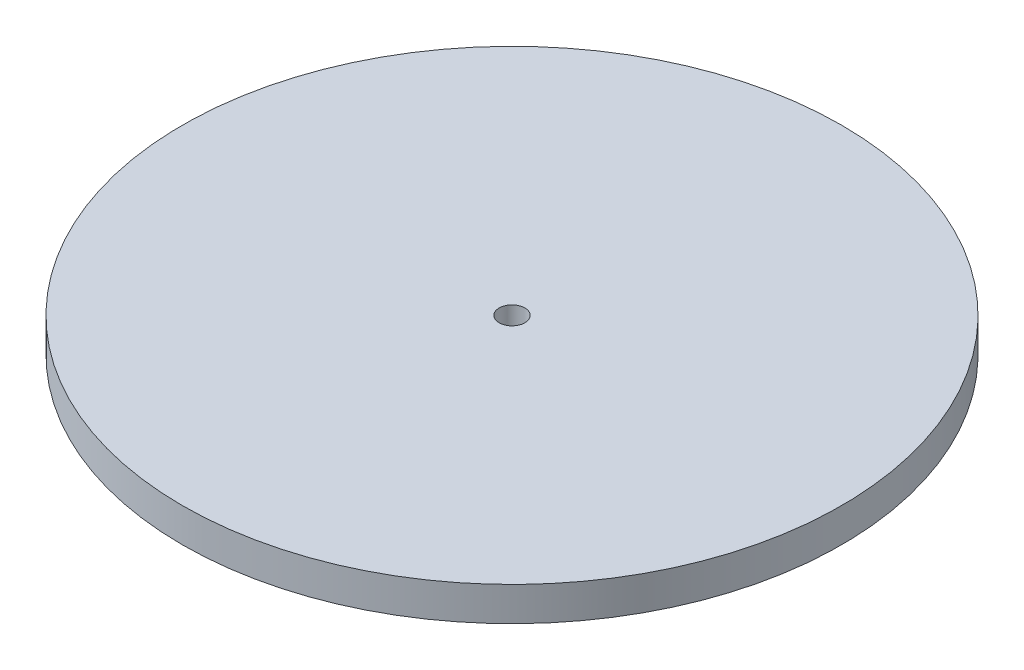
ISO-10303-21;
HEADER;
FILE_DESCRIPTION(('STEP AP214'),'2;1');
FILE_NAME('part.step','',(''),(''),'','','');
FILE_SCHEMA(('AUTOMOTIVE_DESIGN { 1 0 10303 214 1 1 1 1 }'));
ENDSEC;
DATA;
#1=APPLICATION_CONTEXT('core data for automotive mechanical design processes');
#2=APPLICATION_PROTOCOL_DEFINITION('international standard','automotive_design',2000,#1);
#3=PRODUCT_CONTEXT('',#1,'mechanical');
#4=PRODUCT('Part','Part','',(#3));
#5=PRODUCT_RELATED_PRODUCT_CATEGORY('part','',(#4));
#6=PRODUCT_DEFINITION_FORMATION('','',#4);
#7=PRODUCT_DEFINITION_CONTEXT('part definition',#1,'design');
#8=PRODUCT_DEFINITION('design','',#6,#7);
#9=PRODUCT_DEFINITION_SHAPE('','',#8);
#10=(LENGTH_UNIT() NAMED_UNIT(*) SI_UNIT(.MILLI.,.METRE.));
#11=(NAMED_UNIT(*) PLANE_ANGLE_UNIT() SI_UNIT($,.RADIAN.));
#12=(NAMED_UNIT(*) SI_UNIT($,.STERADIAN.) SOLID_ANGLE_UNIT());
#13=UNCERTAINTY_MEASURE_WITH_UNIT(LENGTH_MEASURE(1.E-05),#10,'distance_accuracy_value','');
#14=(GEOMETRIC_REPRESENTATION_CONTEXT(3) GLOBAL_UNCERTAINTY_ASSIGNED_CONTEXT((#13)) GLOBAL_UNIT_ASSIGNED_CONTEXT((#10,
#11,#12)) REPRESENTATION_CONTEXT('',''));
#15=CARTESIAN_POINT('',(0.,0.,0.));
#16=DIRECTION('',(0.,0.,1.));
#17=DIRECTION('',(1.,0.,0.));
#18=AXIS2_PLACEMENT_3D('',#15,#16,#17);
#19=CARTESIAN_POINT('',(0.,6.6,0.));
#20=DIRECTION('',(0.,1.,0.));
#21=DIRECTION('',(0.,0.,1.));
#22=AXIS2_PLACEMENT_3D('',#19,#20,#21);
#23=PLANE('',#22);
#24=CARTESIAN_POINT('',(0.,6.6,0.));
#25=DIRECTION('',(0.,1.,0.));
#26=DIRECTION('',(0.,0.,1.));
#27=AXIS2_PLACEMENT_3D('',#24,#25,#26);
#28=CIRCLE('',#27,64.);
#29=CARTESIAN_POINT('',(0.,6.6,64.));
#30=VERTEX_POINT('',#29);
#31=EDGE_CURVE('E10',#30,#30,#28,.T.);
#32=ORIENTED_EDGE('',*,*,#31,.T.);
#33=EDGE_LOOP('',(#32));
#34=FACE_BOUND('',#33,.T.);
#35=CARTESIAN_POINT('',(0.,6.6,0.));
#36=DIRECTION('',(0.,1.,0.));
#37=DIRECTION('',(0.,0.,1.));
#38=AXIS2_PLACEMENT_3D('',#35,#36,#37);
#39=CIRCLE('',#38,2.5);
#40=CARTESIAN_POINT('',(0.,6.6,2.5));
#41=VERTEX_POINT('',#40);
#42=EDGE_CURVE('E41',#41,#41,#39,.T.);
#43=ORIENTED_EDGE('',*,*,#42,.F.);
#44=EDGE_LOOP('',(#43));
#45=FACE_BOUND('',#44,.T.);
#46=ADVANCED_FACE('F30',(#34,#45),#23,.T.);
#47=CARTESIAN_POINT('',(0.,0.,0.));
#48=DIRECTION('',(0.,1.,0.));
#49=DIRECTION('',(0.,0.,1.));
#50=AXIS2_PLACEMENT_3D('',#47,#48,#49);
#51=PLANE('',#50);
#52=CARTESIAN_POINT('',(0.,0.,0.));
#53=DIRECTION('',(0.,1.,0.));
#54=DIRECTION('',(0.,0.,1.));
#55=AXIS2_PLACEMENT_3D('',#52,#53,#54);
#56=CIRCLE('',#55,64.);
#57=CARTESIAN_POINT('',(0.,0.,64.));
#58=VERTEX_POINT('',#57);
#59=EDGE_CURVE('E34',#58,#58,#56,.T.);
#60=ORIENTED_EDGE('',*,*,#59,.F.);
#61=EDGE_LOOP('',(#60));
#62=FACE_BOUND('',#61,.T.);
#63=CARTESIAN_POINT('',(0.,0.,0.));
#64=DIRECTION('',(0.,1.,0.));
#65=DIRECTION('',(0.,0.,1.));
#66=AXIS2_PLACEMENT_3D('',#63,#64,#65);
#67=CIRCLE('',#66,2.5);
#68=CARTESIAN_POINT('',(0.,0.,2.5));
#69=VERTEX_POINT('',#68);
#70=EDGE_CURVE('E43',#69,#69,#67,.T.);
#71=ORIENTED_EDGE('',*,*,#70,.T.);
#72=EDGE_LOOP('',(#71));
#73=FACE_BOUND('',#72,.T.);
#74=ADVANCED_FACE('F53',(#62,#73),#51,.F.);
#75=CARTESIAN_POINT('',(0.,6.6,0.));
#76=DIRECTION('',(0.,-1.,0.));
#77=DIRECTION('',(0.,0.,-1.));
#78=AXIS2_PLACEMENT_3D('',#75,#76,#77);
#79=CYLINDRICAL_SURFACE('',#78,64.);
#80=ORIENTED_EDGE('',*,*,#31,.F.);
#81=EDGE_LOOP('',(#80));
#82=FACE_BOUND('',#81,.T.);
#83=ORIENTED_EDGE('',*,*,#59,.T.);
#84=EDGE_LOOP('',(#83));
#85=FACE_BOUND('',#84,.T.);
#86=ADVANCED_FACE('F32',(#82,#85),#79,.T.);
#87=CARTESIAN_POINT('',(0.,6.6,0.));
#88=DIRECTION('',(0.,-1.,0.));
#89=DIRECTION('',(0.,0.,-1.));
#90=AXIS2_PLACEMENT_3D('',#87,#88,#89);
#91=CYLINDRICAL_SURFACE('',#90,2.5);
#92=ORIENTED_EDGE('',*,*,#42,.T.);
#93=EDGE_LOOP('',(#92));
#94=FACE_BOUND('',#93,.T.);
#95=ORIENTED_EDGE('',*,*,#70,.F.);
#96=EDGE_LOOP('',(#95));
#97=FACE_BOUND('',#96,.T.);
#98=ADVANCED_FACE('F49',(#94,#97),#91,.F.);
#99=CLOSED_SHELL('',(#46,#74,#86,#98));
#100=MANIFOLD_SOLID_BREP('B2',#99);
#101=ADVANCED_BREP_SHAPE_REPRESENTATION('',(#18,#100),#14);
#102=SHAPE_DEFINITION_REPRESENTATION(#9,#101);
ENDSEC;
END-ISO-10303-21;
